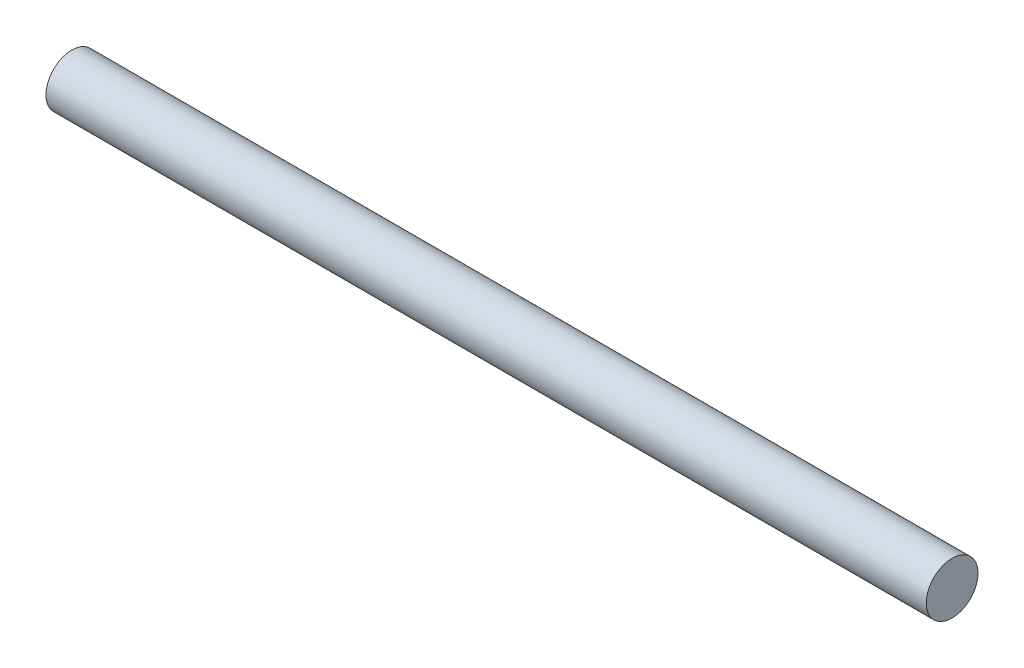
ISO-10303-21;
HEADER;
FILE_DESCRIPTION(('STEP AP214'),'2;1');
FILE_NAME('part.step','',(''),(''),'','','');
FILE_SCHEMA(('AUTOMOTIVE_DESIGN { 1 0 10303 214 1 1 1 1 }'));
ENDSEC;
DATA;
#1=APPLICATION_CONTEXT('core data for automotive mechanical design processes');
#2=APPLICATION_PROTOCOL_DEFINITION('international standard','automotive_design',2000,#1);
#3=PRODUCT_CONTEXT('',#1,'mechanical');
#4=PRODUCT('Part','Part','',(#3));
#5=PRODUCT_RELATED_PRODUCT_CATEGORY('part','',(#4));
#6=PRODUCT_DEFINITION_FORMATION('','',#4);
#7=PRODUCT_DEFINITION_CONTEXT('part definition',#1,'design');
#8=PRODUCT_DEFINITION('design','',#6,#7);
#9=PRODUCT_DEFINITION_SHAPE('','',#8);
#10=(LENGTH_UNIT() NAMED_UNIT(*) SI_UNIT(.MILLI.,.METRE.));
#11=(NAMED_UNIT(*) PLANE_ANGLE_UNIT() SI_UNIT($,.RADIAN.));
#12=(NAMED_UNIT(*) SI_UNIT($,.STERADIAN.) SOLID_ANGLE_UNIT());
#13=UNCERTAINTY_MEASURE_WITH_UNIT(LENGTH_MEASURE(1.E-05),#10,'distance_accuracy_value','');
#14=(GEOMETRIC_REPRESENTATION_CONTEXT(3) GLOBAL_UNCERTAINTY_ASSIGNED_CONTEXT((#13)) GLOBAL_UNIT_ASSIGNED_CONTEXT((#10,
#11,#12)) REPRESENTATION_CONTEXT('',''));
#15=CARTESIAN_POINT('',(0.,0.,0.));
#16=DIRECTION('',(0.,0.,1.));
#17=DIRECTION('',(1.,0.,0.));
#18=AXIS2_PLACEMENT_3D('',#15,#16,#17);
#19=CARTESIAN_POINT('',(102.,0.,0.));
#20=DIRECTION('',(-1.,0.,0.));
#21=DIRECTION('',(0.,0.,1.));
#22=AXIS2_PLACEMENT_3D('',#19,#20,#21);
#23=CYLINDRICAL_SURFACE('',#22,3.);
#24=CARTESIAN_POINT('',(102.,0.,0.));
#25=DIRECTION('',(1.,0.,0.));
#26=DIRECTION('',(0.,0.,-1.));
#27=AXIS2_PLACEMENT_3D('',#24,#25,#26);
#28=CIRCLE('',#27,3.);
#29=CARTESIAN_POINT('',(102.,0.,-3.));
#30=VERTEX_POINT('',#29);
#31=EDGE_CURVE('E10',#30,#30,#28,.T.);
#32=ORIENTED_EDGE('',*,*,#31,.F.);
#33=EDGE_LOOP('',(#32));
#34=FACE_BOUND('',#33,.T.);
#35=CARTESIAN_POINT('',(0.,0.,0.));
#36=DIRECTION('',(1.,0.,0.));
#37=DIRECTION('',(0.,0.,-1.));
#38=AXIS2_PLACEMENT_3D('',#35,#36,#37);
#39=CIRCLE('',#38,3.);
#40=CARTESIAN_POINT('',(0.,0.,-3.));
#41=VERTEX_POINT('',#40);
#42=EDGE_CURVE('E37',#41,#41,#39,.T.);
#43=ORIENTED_EDGE('',*,*,#42,.T.);
#44=EDGE_LOOP('',(#43));
#45=FACE_BOUND('',#44,.T.);
#46=ADVANCED_FACE('F34',(#34,#45),#23,.T.);
#47=CARTESIAN_POINT('',(102.,0.,0.));
#48=DIRECTION('',(1.,0.,0.));
#49=DIRECTION('',(0.,0.,-1.));
#50=AXIS2_PLACEMENT_3D('',#47,#48,#49);
#51=PLANE('',#50);
#52=ORIENTED_EDGE('',*,*,#31,.T.);
#53=EDGE_LOOP('',(#52));
#54=FACE_BOUND('',#53,.T.);
#55=ADVANCED_FACE('F49',(#54),#51,.T.);
#56=CARTESIAN_POINT('',(0.,0.,0.));
#57=DIRECTION('',(1.,0.,0.));
#58=DIRECTION('',(0.,0.,-1.));
#59=AXIS2_PLACEMENT_3D('',#56,#57,#58);
#60=PLANE('',#59);
#61=ORIENTED_EDGE('',*,*,#42,.F.);
#62=EDGE_LOOP('',(#61));
#63=FACE_BOUND('',#62,.T.);
#64=ADVANCED_FACE('F47',(#63),#60,.F.);
#65=CLOSED_SHELL('',(#46,#55,#64));
#66=MANIFOLD_SOLID_BREP('B2',#65);
#67=ADVANCED_BREP_SHAPE_REPRESENTATION('',(#18,#66),#14);
#68=SHAPE_DEFINITION_REPRESENTATION(#9,#67);
ENDSEC;
END-ISO-10303-21;
